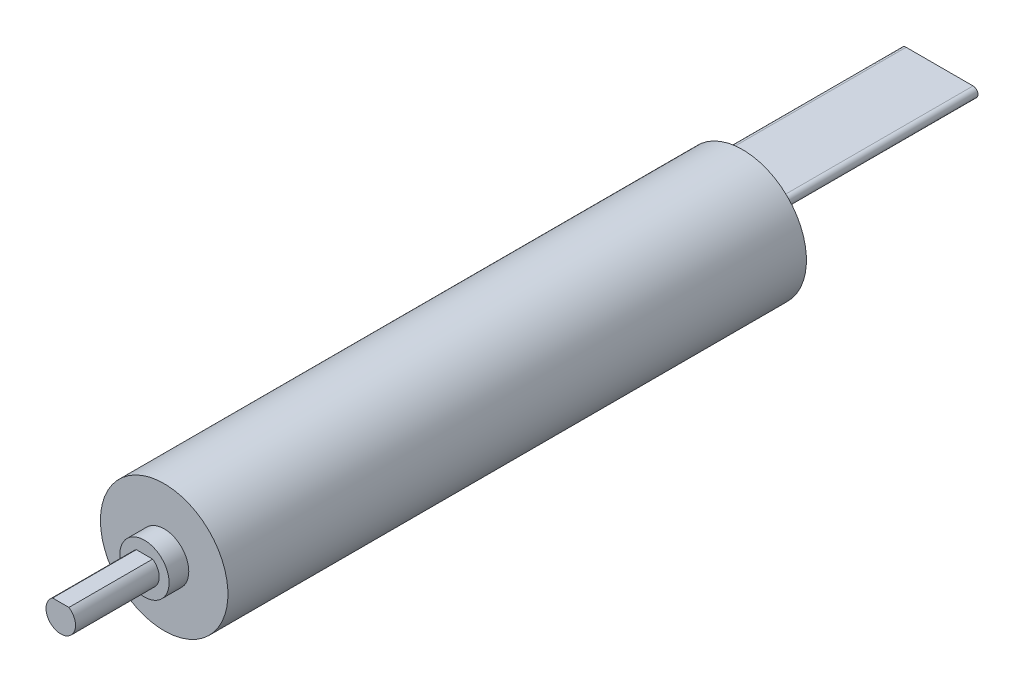
ISO-10303-21;
HEADER;
FILE_DESCRIPTION(('STEP AP214'),'2;1');
FILE_NAME('part.step','',(''),(''),'','','');
FILE_SCHEMA(('AUTOMOTIVE_DESIGN { 1 0 10303 214 1 1 1 1 }'));
ENDSEC;
DATA;
#1=APPLICATION_CONTEXT('core data for automotive mechanical design processes');
#2=APPLICATION_PROTOCOL_DEFINITION('international standard','automotive_design',2000,#1);
#3=PRODUCT_CONTEXT('',#1,'mechanical');
#4=PRODUCT('Part','Part','',(#3));
#5=PRODUCT_RELATED_PRODUCT_CATEGORY('part','',(#4));
#6=PRODUCT_DEFINITION_FORMATION('','',#4);
#7=PRODUCT_DEFINITION_CONTEXT('part definition',#1,'design');
#8=PRODUCT_DEFINITION('design','',#6,#7);
#9=PRODUCT_DEFINITION_SHAPE('','',#8);
#10=(LENGTH_UNIT() NAMED_UNIT(*) SI_UNIT(.MILLI.,.METRE.));
#11=(NAMED_UNIT(*) PLANE_ANGLE_UNIT() SI_UNIT($,.RADIAN.));
#12=(NAMED_UNIT(*) SI_UNIT($,.STERADIAN.) SOLID_ANGLE_UNIT());
#13=UNCERTAINTY_MEASURE_WITH_UNIT(LENGTH_MEASURE(1.E-05),#10,'distance_accuracy_value','');
#14=(GEOMETRIC_REPRESENTATION_CONTEXT(3) GLOBAL_UNCERTAINTY_ASSIGNED_CONTEXT((#13)) GLOBAL_UNIT_ASSIGNED_CONTEXT((#10,
#11,#12)) REPRESENTATION_CONTEXT('',''));
#15=CARTESIAN_POINT('',(0.,0.,0.));
#16=DIRECTION('',(0.,0.,1.));
#17=DIRECTION('',(1.,0.,0.));
#18=AXIS2_PLACEMENT_3D('',#15,#16,#17);
#19=CARTESIAN_POINT('',(0.,0.,0.));
#20=DIRECTION('',(0.,0.,1.));
#21=DIRECTION('',(1.,0.,0.));
#22=AXIS2_PLACEMENT_3D('',#19,#20,#21);
#23=PLANE('',#22);
#24=CARTESIAN_POINT('',(0.,0.,0.));
#25=DIRECTION('',(0.,0.,1.));
#26=DIRECTION('',(1.,0.,0.));
#27=AXIS2_PLACEMENT_3D('',#24,#25,#26);
#28=CIRCLE('',#27,6.475);
#29=CARTESIAN_POINT('',(-6.475,0.,0.));
#30=VERTEX_POINT('',#29);
#31=EDGE_CURVE('E44',#30,#30,#28,.T.);
#32=ORIENTED_EDGE('',*,*,#31,.F.);
#33=EDGE_LOOP('',(#32));
#34=FACE_BOUND('',#33,.T.);
#35=CARTESIAN_POINT('',(3.4,3.275,0.));
#36=DIRECTION('',(0.,0.,-1.));
#37=DIRECTION('',(-1.,0.,0.));
#38=AXIS2_PLACEMENT_3D('',#35,#36,#37);
#39=CIRCLE('',#38,0.500000000000003);
#40=CARTESIAN_POINT('',(3.4,3.775,0.));
#41=VERTEX_POINT('',#40);
#42=CARTESIAN_POINT('',(3.4,2.775,0.));
#43=VERTEX_POINT('',#42);
#44=EDGE_CURVE('E115',#41,#43,#39,.T.);
#45=ORIENTED_EDGE('',*,*,#44,.F.);
#46=DIRECTION('',(1.,0.,0.));
#47=VECTOR('',#46,1.);
#48=CARTESIAN_POINT('',(3.4,3.775,0.));
#49=LINE('',#48,#47);
#50=CARTESIAN_POINT('',(-3.4,3.775,0.));
#51=VERTEX_POINT('',#50);
#52=EDGE_CURVE('E112',#51,#41,#49,.T.);
#53=ORIENTED_EDGE('',*,*,#52,.F.);
#54=CARTESIAN_POINT('',(-3.4,3.275,0.));
#55=DIRECTION('',(0.,0.,-1.));
#56=DIRECTION('',(-1.,0.,0.));
#57=AXIS2_PLACEMENT_3D('',#54,#55,#56);
#58=CIRCLE('',#57,0.500000000000003);
#59=CARTESIAN_POINT('',(-3.4,2.775,0.));
#60=VERTEX_POINT('',#59);
#61=EDGE_CURVE('E62',#60,#51,#58,.T.);
#62=ORIENTED_EDGE('',*,*,#61,.F.);
#63=DIRECTION('',(-1.,0.,0.));
#64=VECTOR('',#63,1.);
#65=CARTESIAN_POINT('',(3.4,2.775,0.));
#66=LINE('',#65,#64);
#67=EDGE_CURVE('E57',#43,#60,#66,.T.);
#68=ORIENTED_EDGE('',*,*,#67,.F.);
#69=EDGE_LOOP('',(#45,#53,#62,#68));
#70=FACE_BOUND('',#69,.T.);
#71=ADVANCED_FACE('F40',(#34,#70),#23,.F.);
#72=CARTESIAN_POINT('',(0.,0.,58.75));
#73=DIRECTION('',(0.,0.,-1.));
#74=DIRECTION('',(-1.,0.,0.));
#75=AXIS2_PLACEMENT_3D('',#72,#73,#74);
#76=CYLINDRICAL_SURFACE('',#75,6.475);
#77=CARTESIAN_POINT('',(0.,0.,58.75));
#78=DIRECTION('',(0.,0.,1.));
#79=DIRECTION('',(1.,0.,0.));
#80=AXIS2_PLACEMENT_3D('',#77,#78,#79);
#81=CIRCLE('',#80,6.475);
#82=CARTESIAN_POINT('',(-6.475,0.,58.75));
#83=VERTEX_POINT('',#82);
#84=EDGE_CURVE('E49',#83,#83,#81,.T.);
#85=CARTESIAN_POINT('',(-6.475,0.,58.75));
#86=CARTESIAN_POINT('',(-6.475,0.,58.1380208333333));
#87=CARTESIAN_POINT('',(-6.475,0.,57.5260416666667));
#88=CARTESIAN_POINT('',(-6.475,0.,56.3020833333333));
#89=CARTESIAN_POINT('',(-6.475,0.,55.6901041666667));
#90=CARTESIAN_POINT('',(-6.475,0.,54.4661458333333));
#91=CARTESIAN_POINT('',(-6.475,0.,53.8541666666667));
#92=CARTESIAN_POINT('',(-6.475,0.,52.6302083333333));
#93=CARTESIAN_POINT('',(-6.475,0.,52.0182291666667));
#94=CARTESIAN_POINT('',(-6.475,0.,50.7942708333333));
#95=CARTESIAN_POINT('',(-6.475,0.,50.1822916666667));
#96=CARTESIAN_POINT('',(-6.475,0.,48.9583333333333));
#97=CARTESIAN_POINT('',(-6.475,0.,48.3463541666667));
#98=CARTESIAN_POINT('',(-6.475,0.,47.1223958333333));
#99=CARTESIAN_POINT('',(-6.475,0.,46.5104166666667));
#100=CARTESIAN_POINT('',(-6.475,0.,45.2864583333333));
#101=CARTESIAN_POINT('',(-6.475,0.,44.6744791666667));
#102=CARTESIAN_POINT('',(-6.475,0.,43.4505208333333));
#103=CARTESIAN_POINT('',(-6.475,0.,42.8385416666667));
#104=CARTESIAN_POINT('',(-6.475,0.,41.6145833333333));
#105=CARTESIAN_POINT('',(-6.475,0.,41.0026041666667));
#106=CARTESIAN_POINT('',(-6.475,0.,39.7786458333333));
#107=CARTESIAN_POINT('',(-6.475,0.,39.1666666666667));
#108=CARTESIAN_POINT('',(-6.475,0.,37.9427083333333));
#109=CARTESIAN_POINT('',(-6.475,0.,37.3307291666667));
#110=CARTESIAN_POINT('',(-6.475,0.,36.1067708333333));
#111=CARTESIAN_POINT('',(-6.475,0.,35.4947916666667));
#112=CARTESIAN_POINT('',(-6.475,0.,34.2708333333333));
#113=CARTESIAN_POINT('',(-6.475,0.,33.6588541666667));
#114=CARTESIAN_POINT('',(-6.475,0.,32.4348958333333));
#115=CARTESIAN_POINT('',(-6.475,0.,31.8229166666667));
#116=CARTESIAN_POINT('',(-6.475,0.,30.5989583333333));
#117=CARTESIAN_POINT('',(-6.475,0.,29.9869791666667));
#118=CARTESIAN_POINT('',(-6.475,0.,28.7630208333333));
#119=CARTESIAN_POINT('',(-6.475,0.,28.1510416666667));
#120=CARTESIAN_POINT('',(-6.475,0.,26.9270833333333));
#121=CARTESIAN_POINT('',(-6.475,0.,26.3151041666667));
#122=CARTESIAN_POINT('',(-6.475,0.,25.0911458333333));
#123=CARTESIAN_POINT('',(-6.475,0.,24.4791666666667));
#124=CARTESIAN_POINT('',(-6.475,0.,23.2552083333333));
#125=CARTESIAN_POINT('',(-6.475,0.,22.6432291666667));
#126=CARTESIAN_POINT('',(-6.475,0.,21.4192708333333));
#127=CARTESIAN_POINT('',(-6.475,0.,20.8072916666667));
#128=CARTESIAN_POINT('',(-6.475,0.,19.5833333333333));
#129=CARTESIAN_POINT('',(-6.475,0.,18.9713541666667));
#130=CARTESIAN_POINT('',(-6.475,0.,17.7473958333333));
#131=CARTESIAN_POINT('',(-6.475,0.,17.1354166666667));
#132=CARTESIAN_POINT('',(-6.475,0.,15.9114583333333));
#133=CARTESIAN_POINT('',(-6.475,0.,15.2994791666667));
#134=CARTESIAN_POINT('',(-6.475,0.,14.0755208333333));
#135=CARTESIAN_POINT('',(-6.475,0.,13.4635416666667));
#136=CARTESIAN_POINT('',(-6.475,0.,12.2395833333333));
#137=CARTESIAN_POINT('',(-6.475,0.,11.6276041666667));
#138=CARTESIAN_POINT('',(-6.475,0.,10.4036458333333));
#139=CARTESIAN_POINT('',(-6.475,0.,9.79166666666666));
#140=CARTESIAN_POINT('',(-6.475,0.,8.56770833333333));
#141=CARTESIAN_POINT('',(-6.475,0.,7.95572916666666));
#142=CARTESIAN_POINT('',(-6.475,0.,6.73177083333333));
#143=CARTESIAN_POINT('',(-6.475,0.,6.11979166666666));
#144=CARTESIAN_POINT('',(-6.475,0.,4.89583333333333));
#145=CARTESIAN_POINT('',(-6.475,0.,4.28385416666666));
#146=CARTESIAN_POINT('',(-6.475,0.,3.05989583333333));
#147=CARTESIAN_POINT('',(-6.475,0.,2.44791666666666));
#148=CARTESIAN_POINT('',(-6.475,0.,1.22395833333333));
#149=CARTESIAN_POINT('',(-6.475,0.,0.61197916666666));
#150=CARTESIAN_POINT('',(-6.475,0.,0.));
#151=B_SPLINE_CURVE_WITH_KNOTS('',3,(#85,#86,#87,#88,#89,#90,#91,#92,#93,#94,#95,#96,#97,#98,
#99,#100,#101,#102,#103,#104,#105,#106,#107,#108,#109,#110,#111,#112,#113,#114,#115,#116,#117,
#118,#119,#120,#121,#122,#123,#124,#125,#126,#127,#128,#129,#130,#131,#132,#133,#134,#135,#136,
#137,#138,#139,#140,#141,#142,#143,#144,#145,#146,#147,#148,#149,#150),.UNSPECIFIED.,.F.,.F.,(4,
2,2,2,2,2,2,2,2,2,2,2,2,2,2,2,2,2,2,2,2,2,2,2,2,2,2,2,2,2,2,2,4),(0.,1.8359375,3.671875,
5.5078125,7.34375,9.17968750000001,11.015625,12.8515625,14.6875,16.5234375,18.359375,20.1953125,
22.03125,23.8671875,25.703125,27.5390625,29.375,31.2109375,33.046875,34.8828125,36.71875,
38.5546875,40.390625,42.2265625,44.0625,45.8984375,47.734375,49.5703125,51.40625,53.2421875,
55.078125,56.9140625,58.75),.UNSPECIFIED.);
#152=EDGE_CURVE('BSEAM42',#83,#30,#151,.T.);
#153=ORIENTED_EDGE('',*,*,#84,.F.);
#154=ORIENTED_EDGE('',*,*,#31,.T.);
#155=ORIENTED_EDGE('',*,*,#152,.T.);
#156=ORIENTED_EDGE('',*,*,#152,.F.);
#157=EDGE_LOOP('',(#153,#155,#154,#156));
#158=FACE_BOUND('',#157,.T.);
#159=ADVANCED_FACE('F42',(#158),#76,.T.);
#160=CARTESIAN_POINT('',(0.,0.,58.75));
#161=DIRECTION('',(0.,0.,1.));
#162=DIRECTION('',(1.,0.,0.));
#163=AXIS2_PLACEMENT_3D('',#160,#161,#162);
#164=PLANE('',#163);
#165=CARTESIAN_POINT('',(0.,0.,58.75));
#166=DIRECTION('',(0.,0.,1.));
#167=DIRECTION('',(1.,0.,0.));
#168=AXIS2_PLACEMENT_3D('',#165,#166,#167);
#169=CIRCLE('',#168,2.5);
#170=CARTESIAN_POINT('',(2.5,0.,58.75));
#171=VERTEX_POINT('',#170);
#172=EDGE_CURVE('E11',#171,#171,#169,.T.);
#173=ORIENTED_EDGE('',*,*,#172,.F.);
#174=EDGE_LOOP('',(#173));
#175=FACE_BOUND('',#174,.T.);
#176=ORIENTED_EDGE('',*,*,#84,.T.);
#177=EDGE_LOOP('',(#176));
#178=FACE_BOUND('',#177,.T.);
#179=ADVANCED_FACE('F192',(#175,#178),#164,.T.);
#180=CARTESIAN_POINT('',(0.,0.,60.75));
#181=DIRECTION('',(0.,0.,-1.));
#182=DIRECTION('',(-1.,0.,0.));
#183=AXIS2_PLACEMENT_3D('',#180,#181,#182);
#184=CYLINDRICAL_SURFACE('',#183,2.5);
#185=CARTESIAN_POINT('',(0.,0.,60.75));
#186=DIRECTION('',(0.,0.,1.));
#187=DIRECTION('',(1.,0.,0.));
#188=AXIS2_PLACEMENT_3D('',#185,#186,#187);
#189=CIRCLE('',#188,2.5);
#190=CARTESIAN_POINT('',(2.5,0.,60.75));
#191=VERTEX_POINT('',#190);
#192=EDGE_CURVE('E136',#191,#191,#189,.T.);
#193=ORIENTED_EDGE('',*,*,#192,.F.);
#194=EDGE_LOOP('',(#193));
#195=FACE_BOUND('',#194,.T.);
#196=ORIENTED_EDGE('',*,*,#172,.T.);
#197=EDGE_LOOP('',(#196));
#198=FACE_BOUND('',#197,.T.);
#199=ADVANCED_FACE('F188',(#195,#198),#184,.T.);
#200=CARTESIAN_POINT('',(0.,0.,60.75));
#201=DIRECTION('',(0.,0.,1.));
#202=DIRECTION('',(1.,0.,0.));
#203=AXIS2_PLACEMENT_3D('',#200,#201,#202);
#204=PLANE('',#203);
#205=CARTESIAN_POINT('',(0.,0.,60.75));
#206=DIRECTION('',(0.,0.,1.));
#207=DIRECTION('',(1.,0.,0.));
#208=AXIS2_PLACEMENT_3D('',#205,#206,#207);
#209=CIRCLE('',#208,1.5);
#210=CARTESIAN_POINT('',(-0.829156197588851,1.25,60.75));
#211=VERTEX_POINT('',#210);
#212=CARTESIAN_POINT('',(0.829156197588851,1.25,60.75));
#213=VERTEX_POINT('',#212);
#214=EDGE_CURVE('E116',#211,#213,#209,.T.);
#215=ORIENTED_EDGE('',*,*,#214,.F.);
#216=DIRECTION('',(1.,0.,0.));
#217=VECTOR('',#216,1.);
#218=CARTESIAN_POINT('',(0.,1.25,60.75));
#219=LINE('',#218,#217);
#220=EDGE_CURVE('E118',#211,#213,#219,.T.);
#221=ORIENTED_EDGE('',*,*,#220,.T.);
#222=EDGE_LOOP('',(#215,#221));
#223=FACE_BOUND('',#222,.T.);
#224=ORIENTED_EDGE('',*,*,#192,.T.);
#225=EDGE_LOOP('',(#224));
#226=FACE_BOUND('',#225,.T.);
#227=ADVANCED_FACE('F184',(#223,#226),#204,.T.);
#228=CARTESIAN_POINT('',(0.,0.,69.25));
#229=DIRECTION('',(0.,0.,-1.));
#230=DIRECTION('',(-1.,0.,0.));
#231=AXIS2_PLACEMENT_3D('',#228,#229,#230);
#232=CYLINDRICAL_SURFACE('',#231,1.5);
#233=ORIENTED_EDGE('',*,*,#214,.T.);
#234=DIRECTION('',(0.,0.,-1.));
#235=VECTOR('',#234,1.);
#236=CARTESIAN_POINT('',(0.829156197588851,1.25,69.25));
#237=LINE('',#236,#235);
#238=CARTESIAN_POINT('',(0.829156197588851,1.25,69.25));
#239=VERTEX_POINT('',#238);
#240=EDGE_CURVE('E133',#239,#213,#237,.T.);
#241=ORIENTED_EDGE('',*,*,#240,.F.);
#242=CARTESIAN_POINT('',(0.,0.,69.25));
#243=DIRECTION('',(0.,0.,1.));
#244=DIRECTION('',(1.,0.,0.));
#245=AXIS2_PLACEMENT_3D('',#242,#243,#244);
#246=CIRCLE('',#245,1.5);
#247=CARTESIAN_POINT('',(-0.829156197588851,1.25,69.25));
#248=VERTEX_POINT('',#247);
#249=EDGE_CURVE('E124',#248,#239,#246,.T.);
#250=ORIENTED_EDGE('',*,*,#249,.F.);
#251=DIRECTION('',(0.,0.,-1.));
#252=VECTOR('',#251,1.);
#253=CARTESIAN_POINT('',(-0.829156197588851,1.25,69.25));
#254=LINE('',#253,#252);
#255=EDGE_CURVE('E128',#248,#211,#254,.T.);
#256=ORIENTED_EDGE('',*,*,#255,.T.);
#257=EDGE_LOOP('',(#233,#241,#250,#256));
#258=FACE_BOUND('',#257,.T.);
#259=ADVANCED_FACE('F180',(#258),#232,.T.);
#260=CARTESIAN_POINT('',(0.,1.25,69.25));
#261=DIRECTION('',(0.,1.,0.));
#262=DIRECTION('',(0.,0.,1.));
#263=AXIS2_PLACEMENT_3D('',#260,#261,#262);
#264=PLANE('',#263);
#265=ORIENTED_EDGE('',*,*,#220,.F.);
#266=ORIENTED_EDGE('',*,*,#255,.F.);
#267=DIRECTION('',(1.,0.,0.));
#268=VECTOR('',#267,1.);
#269=CARTESIAN_POINT('',(0.,1.25,69.25));
#270=LINE('',#269,#268);
#271=EDGE_CURVE('E126',#248,#239,#270,.T.);
#272=ORIENTED_EDGE('',*,*,#271,.T.);
#273=ORIENTED_EDGE('',*,*,#240,.T.);
#274=EDGE_LOOP('',(#265,#266,#272,#273));
#275=FACE_BOUND('',#274,.T.);
#276=ADVANCED_FACE('F176',(#275),#264,.T.);
#277=CARTESIAN_POINT('',(0.,0.,69.25));
#278=DIRECTION('',(0.,0.,1.));
#279=DIRECTION('',(1.,0.,0.));
#280=AXIS2_PLACEMENT_3D('',#277,#278,#279);
#281=PLANE('',#280);
#282=ORIENTED_EDGE('',*,*,#249,.T.);
#283=ORIENTED_EDGE('',*,*,#271,.F.);
#284=EDGE_LOOP('',(#282,#283));
#285=FACE_BOUND('',#284,.T.);
#286=ADVANCED_FACE('F173',(#285),#281,.T.);
#287=CARTESIAN_POINT('',(3.4,3.275,-20.));
#288=DIRECTION('',(0.,0.,1.));
#289=DIRECTION('',(1.,0.,0.));
#290=AXIS2_PLACEMENT_3D('',#287,#288,#289);
#291=CYLINDRICAL_SURFACE('',#290,0.500000000000003);
#292=ORIENTED_EDGE('',*,*,#44,.T.);
#293=DIRECTION('',(0.,0.,1.));
#294=VECTOR('',#293,1.);
#295=CARTESIAN_POINT('',(3.4,2.775,-20.));
#296=LINE('',#295,#294);
#297=CARTESIAN_POINT('',(3.4,2.775,-20.));
#298=VERTEX_POINT('',#297);
#299=EDGE_CURVE('E96',#298,#43,#296,.T.);
#300=ORIENTED_EDGE('',*,*,#299,.F.);
#301=CARTESIAN_POINT('',(3.4,3.275,-20.));
#302=DIRECTION('',(0.,0.,-1.));
#303=DIRECTION('',(-1.,0.,0.));
#304=AXIS2_PLACEMENT_3D('',#301,#302,#303);
#305=CIRCLE('',#304,0.500000000000003);
#306=CARTESIAN_POINT('',(3.4,3.775,-20.));
#307=VERTEX_POINT('',#306);
#308=EDGE_CURVE('E103',#307,#298,#305,.T.);
#309=ORIENTED_EDGE('',*,*,#308,.F.);
#310=DIRECTION('',(0.,0.,1.));
#311=VECTOR('',#310,1.);
#312=CARTESIAN_POINT('',(3.4,3.775,-20.));
#313=LINE('',#312,#311);
#314=EDGE_CURVE('E151',#307,#41,#313,.T.);
#315=ORIENTED_EDGE('',*,*,#314,.T.);
#316=EDGE_LOOP('',(#292,#300,#309,#315));
#317=FACE_BOUND('',#316,.T.);
#318=ADVANCED_FACE('F114',(#317),#291,.T.);
#319=CARTESIAN_POINT('',(3.4,2.775,-20.));
#320=DIRECTION('',(0.,1.,0.));
#321=DIRECTION('',(-1.,0.,0.));
#322=AXIS2_PLACEMENT_3D('',#319,#320,#321);
#323=PLANE('',#322);
#324=ORIENTED_EDGE('',*,*,#67,.T.);
#325=DIRECTION('',(0.,0.,1.));
#326=VECTOR('',#325,1.);
#327=CARTESIAN_POINT('',(-3.4,2.775,-20.));
#328=LINE('',#327,#326);
#329=CARTESIAN_POINT('',(-3.4,2.775,-20.));
#330=VERTEX_POINT('',#329);
#331=EDGE_CURVE('E99',#330,#60,#328,.T.);
#332=ORIENTED_EDGE('',*,*,#331,.F.);
#333=DIRECTION('',(-1.,0.,0.));
#334=VECTOR('',#333,1.);
#335=CARTESIAN_POINT('',(3.4,2.775,-20.));
#336=LINE('',#335,#334);
#337=EDGE_CURVE('E92',#298,#330,#336,.T.);
#338=ORIENTED_EDGE('',*,*,#337,.F.);
#339=ORIENTED_EDGE('',*,*,#299,.T.);
#340=EDGE_LOOP('',(#324,#332,#338,#339));
#341=FACE_BOUND('',#340,.T.);
#342=ADVANCED_FACE('F94',(#341),#323,.F.);
#343=CARTESIAN_POINT('',(-3.4,3.275,-20.));
#344=DIRECTION('',(0.,0.,1.));
#345=DIRECTION('',(1.,0.,0.));
#346=AXIS2_PLACEMENT_3D('',#343,#344,#345);
#347=CYLINDRICAL_SURFACE('',#346,0.500000000000003);
#348=ORIENTED_EDGE('',*,*,#61,.T.);
#349=DIRECTION('',(0.,0.,1.));
#350=VECTOR('',#349,1.);
#351=CARTESIAN_POINT('',(-3.4,3.775,-20.));
#352=LINE('',#351,#350);
#353=CARTESIAN_POINT('',(-3.4,3.775,-20.));
#354=VERTEX_POINT('',#353);
#355=EDGE_CURVE('E120',#354,#51,#352,.T.);
#356=ORIENTED_EDGE('',*,*,#355,.F.);
#357=CARTESIAN_POINT('',(-3.4,3.275,-20.));
#358=DIRECTION('',(0.,0.,-1.));
#359=DIRECTION('',(-1.,0.,0.));
#360=AXIS2_PLACEMENT_3D('',#357,#358,#359);
#361=CIRCLE('',#360,0.500000000000003);
#362=EDGE_CURVE('E102',#330,#354,#361,.T.);
#363=ORIENTED_EDGE('',*,*,#362,.F.);
#364=ORIENTED_EDGE('',*,*,#331,.T.);
#365=EDGE_LOOP('',(#348,#356,#363,#364));
#366=FACE_BOUND('',#365,.T.);
#367=ADVANCED_FACE('F160',(#366),#347,.T.);
#368=CARTESIAN_POINT('',(3.4,3.775,-20.));
#369=DIRECTION('',(0.,-1.,0.));
#370=DIRECTION('',(1.,0.,0.));
#371=AXIS2_PLACEMENT_3D('',#368,#369,#370);
#372=PLANE('',#371);
#373=ORIENTED_EDGE('',*,*,#52,.T.);
#374=ORIENTED_EDGE('',*,*,#314,.F.);
#375=DIRECTION('',(1.,0.,0.));
#376=VECTOR('',#375,1.);
#377=CARTESIAN_POINT('',(3.4,3.775,-20.));
#378=LINE('',#377,#376);
#379=EDGE_CURVE('E108',#354,#307,#378,.T.);
#380=ORIENTED_EDGE('',*,*,#379,.F.);
#381=ORIENTED_EDGE('',*,*,#355,.T.);
#382=EDGE_LOOP('',(#373,#374,#380,#381));
#383=FACE_BOUND('',#382,.T.);
#384=ADVANCED_FACE('F150',(#383),#372,.F.);
#385=CARTESIAN_POINT('',(3.4,3.275,-20.));
#386=DIRECTION('',(0.,0.,-1.));
#387=DIRECTION('',(-1.,0.,0.));
#388=AXIS2_PLACEMENT_3D('',#385,#386,#387);
#389=PLANE('',#388);
#390=ORIENTED_EDGE('',*,*,#308,.T.);
#391=ORIENTED_EDGE('',*,*,#337,.T.);
#392=ORIENTED_EDGE('',*,*,#362,.T.);
#393=ORIENTED_EDGE('',*,*,#379,.T.);
#394=EDGE_LOOP('',(#390,#391,#392,#393));
#395=FACE_BOUND('',#394,.T.);
#396=ADVANCED_FACE('F106',(#395),#389,.T.);
#397=CLOSED_SHELL('',(#71,#159,#179,#199,#227,#259,#276,#286,#318,#342,#367,#384,#396));
#398=MANIFOLD_SOLID_BREP('B2',#397);
#399=ADVANCED_BREP_SHAPE_REPRESENTATION('',(#18,#398),#14);
#400=SHAPE_DEFINITION_REPRESENTATION(#9,#399);
ENDSEC;
END-ISO-10303-21;
